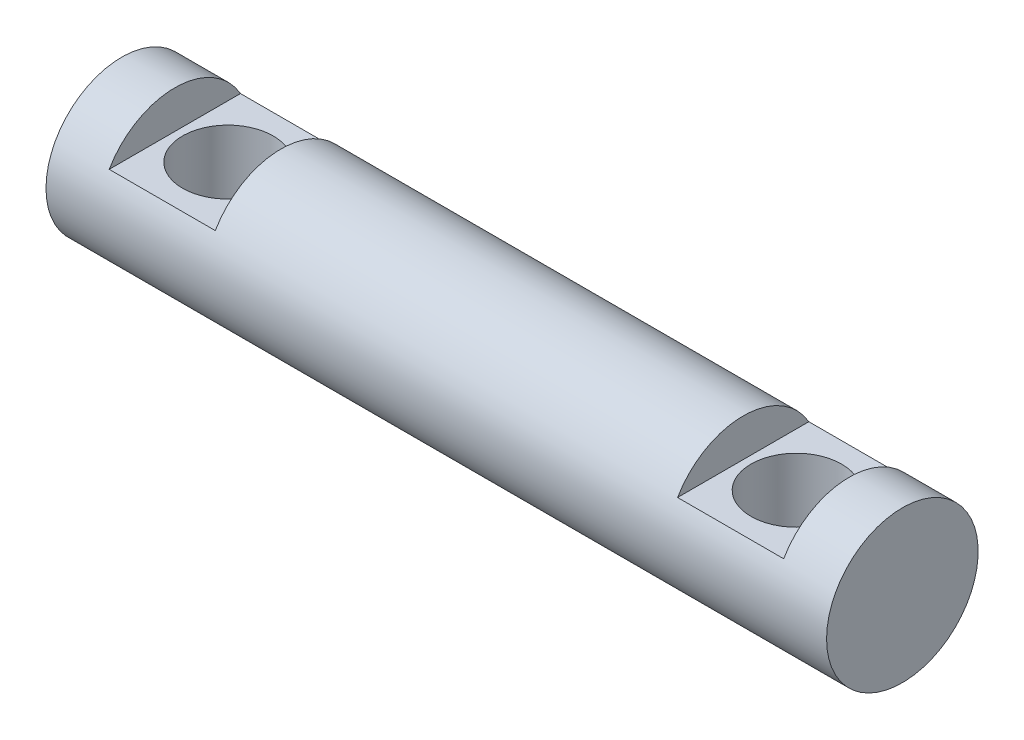
ISO-10303-21;
HEADER;
FILE_DESCRIPTION(('STEP AP214'),'2;1');
FILE_NAME('part.step','',(''),(''),'','','');
FILE_SCHEMA(('AUTOMOTIVE_DESIGN { 1 0 10303 214 1 1 1 1 }'));
ENDSEC;
DATA;
#1=APPLICATION_CONTEXT('core data for automotive mechanical design processes');
#2=APPLICATION_PROTOCOL_DEFINITION('international standard','automotive_design',2000,#1);
#3=PRODUCT_CONTEXT('',#1,'mechanical');
#4=PRODUCT('Part','Part','',(#3));
#5=PRODUCT_RELATED_PRODUCT_CATEGORY('part','',(#4));
#6=PRODUCT_DEFINITION_FORMATION('','',#4);
#7=PRODUCT_DEFINITION_CONTEXT('part definition',#1,'design');
#8=PRODUCT_DEFINITION('design','',#6,#7);
#9=PRODUCT_DEFINITION_SHAPE('','',#8);
#10=(LENGTH_UNIT() NAMED_UNIT(*) SI_UNIT(.MILLI.,.METRE.));
#11=(NAMED_UNIT(*) PLANE_ANGLE_UNIT() SI_UNIT($,.RADIAN.));
#12=(NAMED_UNIT(*) SI_UNIT($,.STERADIAN.) SOLID_ANGLE_UNIT());
#13=UNCERTAINTY_MEASURE_WITH_UNIT(LENGTH_MEASURE(1.E-05),#10,'distance_accuracy_value','');
#14=(GEOMETRIC_REPRESENTATION_CONTEXT(3) GLOBAL_UNCERTAINTY_ASSIGNED_CONTEXT((#13)) GLOBAL_UNIT_ASSIGNED_CONTEXT((#10,
#11,#12)) REPRESENTATION_CONTEXT('',''));
#15=CARTESIAN_POINT('',(0.,0.,0.));
#16=DIRECTION('',(0.,0.,1.));
#17=DIRECTION('',(1.,0.,0.));
#18=AXIS2_PLACEMENT_3D('',#15,#16,#17);
#19=CARTESIAN_POINT('',(0.,0.,0.));
#20=DIRECTION('',(-1.,0.,0.));
#21=DIRECTION('',(0.,0.,1.));
#22=AXIS2_PLACEMENT_3D('',#19,#20,#21);
#23=CYLINDRICAL_SURFACE('',#22,10.);
#24=CARTESIAN_POINT('',(103.,0.,0.));
#25=DIRECTION('',(-1.,0.,0.));
#26=DIRECTION('',(0.,0.,1.));
#27=AXIS2_PLACEMENT_3D('',#24,#25,#26);
#28=CIRCLE('',#27,10.);
#29=CARTESIAN_POINT('',(103.,0.,10.));
#30=VERTEX_POINT('',#29);
#31=EDGE_CURVE('E120',#30,#30,#28,.T.);
#32=ORIENTED_EDGE('',*,*,#31,.T.);
#33=EDGE_LOOP('',(#32));
#34=FACE_BOUND('',#33,.T.);
#35=CARTESIAN_POINT('',(0.,0.,0.));
#36=DIRECTION('',(-1.,0.,0.));
#37=DIRECTION('',(0.,0.,1.));
#38=AXIS2_PLACEMENT_3D('',#35,#36,#37);
#39=CIRCLE('',#38,10.);
#40=CARTESIAN_POINT('',(0.,0.,10.));
#41=VERTEX_POINT('',#40);
#42=EDGE_CURVE('E116',#41,#41,#39,.T.);
#43=ORIENTED_EDGE('',*,*,#42,.F.);
#44=EDGE_LOOP('',(#43));
#45=FACE_BOUND('',#44,.T.);
#46=CARTESIAN_POINT('',(96.,0.,0.));
#47=DIRECTION('',(1.,0.,0.));
#48=DIRECTION('',(0.,0.,-1.));
#49=AXIS2_PLACEMENT_3D('',#46,#47,#48);
#50=CIRCLE('',#49,10.);
#51=CARTESIAN_POINT('',(96.,5.,-8.66025403784439));
#52=VERTEX_POINT('',#51);
#53=CARTESIAN_POINT('',(96.,5.,8.66025403784439));
#54=VERTEX_POINT('',#53);
#55=EDGE_CURVE('E182',#52,#54,#50,.T.);
#56=ORIENTED_EDGE('',*,*,#55,.T.);
#57=DIRECTION('',(-1.,0.,0.));
#58=VECTOR('',#57,1.);
#59=CARTESIAN_POINT('',(0.,5.,8.66025403784439));
#60=LINE('',#59,#58);
#61=CARTESIAN_POINT('',(82.,5.,8.66025403784439));
#62=VERTEX_POINT('',#61);
#63=EDGE_CURVE('E112',#54,#62,#60,.T.);
#64=ORIENTED_EDGE('',*,*,#63,.T.);
#65=CARTESIAN_POINT('',(82.,0.,0.));
#66=DIRECTION('',(1.,0.,0.));
#67=DIRECTION('',(0.,0.,-1.));
#68=AXIS2_PLACEMENT_3D('',#65,#66,#67);
#69=CIRCLE('',#68,10.);
#70=CARTESIAN_POINT('',(82.,5.,-8.66025403784439));
#71=VERTEX_POINT('',#70);
#72=EDGE_CURVE('E188',#71,#62,#69,.T.);
#73=ORIENTED_EDGE('',*,*,#72,.F.);
#74=DIRECTION('',(-1.,0.,0.));
#75=VECTOR('',#74,1.);
#76=CARTESIAN_POINT('',(0.,5.,-8.66025403784439));
#77=LINE('',#76,#75);
#78=EDGE_CURVE('E108',#71,#52,#77,.F.);
#79=ORIENTED_EDGE('',*,*,#78,.T.);
#80=EDGE_LOOP('',(#56,#64,#73,#79));
#81=FACE_BOUND('',#80,.T.);
#82=CARTESIAN_POINT('',(83.017,-10.,0.));
#83=CARTESIAN_POINT('',(83.0170012592624,-9.99999883002161,0.153172315355917));
#84=CARTESIAN_POINT('',(83.0228913696915,-9.996471741835,0.306385435995094));
#85=CARTESIAN_POINT('',(83.0463771135823,-9.98244711097892,0.611656772831272));
#86=CARTESIAN_POINT('',(83.063979714023,-9.97194541959012,0.763714247129809));
#87=CARTESIAN_POINT('',(83.1106961817195,-9.94420717609116,1.06572990920689));
#88=CARTESIAN_POINT('',(83.1398321964793,-9.92695766696624,1.21568347982575));
#89=CARTESIAN_POINT('',(83.2092455908321,-9.88613982957446,1.5121668832874));
#90=CARTESIAN_POINT('',(83.2495277309124,-9.86256880153235,1.6586952241575));
#91=CARTESIAN_POINT('',(83.340500888076,-9.809804997573,1.94653844643532));
#92=CARTESIAN_POINT('',(83.3911341499098,-9.78064346838609,2.08787733235822));
#93=CARTESIAN_POINT('',(83.5024080646036,-9.71726022787209,2.36540813806157));
#94=CARTESIAN_POINT('',(83.5630525832958,-9.68303656234141,2.50159804450516));
#95=CARTESIAN_POINT('',(83.7590853513287,-9.57387303871737,2.90120248947348));
#96=CARTESIAN_POINT('',(83.9086902313427,-9.49237068470068,3.15601827219648));
#97=CARTESIAN_POINT('',(84.2539720526065,-9.31156338389999,3.65665167787378));
#98=CARTESIAN_POINT('',(84.4522917269169,-9.21137495306655,3.90030260097493));
#99=CARTESIAN_POINT('',(84.8836353237701,-9.00622653496039,4.35312068301917));
#100=CARTESIAN_POINT('',(85.1167035751344,-8.90126057357486,4.56224306502644));
#101=CARTESIAN_POINT('',(85.5045251713547,-8.74105166750114,4.85888645828946));
#102=CARTESIAN_POINT('',(85.6487870779499,-8.68419419318971,4.95951050214589));
#103=CARTESIAN_POINT('',(85.9465688262679,-8.57368255902221,5.14819398507323));
#104=CARTESIAN_POINT('',(86.100090177839,-8.52002892443928,5.23625136709718));
#105=CARTESIAN_POINT('',(86.4154889327902,-8.41790827118968,5.39889242806681));
#106=CARTESIAN_POINT('',(86.5773550956577,-8.36943453248746,5.47349365275356));
#107=CARTESIAN_POINT('',(86.908787480234,-8.27958203968969,5.60848483378958));
#108=CARTESIAN_POINT('',(87.0783508216371,-8.23820065884931,5.66888005461255));
#109=CARTESIAN_POINT('',(87.382471757487,-8.17334957955253,5.76183556406732));
#110=CARTESIAN_POINT('',(87.5156502136676,-8.14796522287945,5.79759712653813));
#111=CARTESIAN_POINT('',(87.7851117046681,-8.10321104912285,5.85998709074792));
#112=CARTESIAN_POINT('',(87.9213940488584,-8.08383990783669,5.88661750344198));
#113=CARTESIAN_POINT('',(88.196116110255,-8.05179184223029,5.93037822393736));
#114=CARTESIAN_POINT('',(88.3345534812252,-8.03910809923203,5.94751820937034));
#115=CARTESIAN_POINT('',(88.6127632931179,-8.02087278433981,5.97208807718028));
#116=CARTESIAN_POINT('',(88.7525357572452,-8.01532133663807,5.97951779047561));
#117=CARTESIAN_POINT('',(89.0326278609301,-8.01156228449002,5.98455348136233));
#118=CARTESIAN_POINT('',(89.1729480358812,-8.01336885898131,5.98214049201364));
#119=CARTESIAN_POINT('',(89.4527832834944,-8.02428632158673,5.96748779994581));
#120=CARTESIAN_POINT('',(89.592298352275,-8.03339724488638,5.95524804989051));
#121=CARTESIAN_POINT('',(89.869568985983,-8.05858523443595,5.92111923494675));
#122=CARTESIAN_POINT('',(90.0073237350139,-8.07466541835132,5.89922585147521));
#123=CARTESIAN_POINT('',(90.2801314138693,-8.11320952046305,5.84610109018177));
#124=CARTESIAN_POINT('',(90.4151832161893,-8.13567604559684,5.81486589871361));
#125=CARTESIAN_POINT('',(90.8116755487973,-8.21092585612069,5.70860911718773));
#126=CARTESIAN_POINT('',(91.0681975812124,-8.27193397576603,5.62055926785735));
#127=CARTESIAN_POINT('',(91.5633450539645,-8.40937385549081,5.41275251930397));
#128=CARTESIAN_POINT('',(91.8019638747095,-8.4858112822785,5.29298396572308));
#129=CARTESIAN_POINT('',(92.2989348710774,-8.66162077688792,5.00100868771718));
#130=CARTESIAN_POINT('',(92.5534973011397,-8.76266931489177,4.82330401688185));
#131=CARTESIAN_POINT('',(92.9119701405439,-8.9160286634058,4.52953873119934));
#132=CARTESIAN_POINT('',(93.0276461169262,-8.96748657579318,4.4269926546011));
#133=CARTESIAN_POINT('',(93.2508770688062,-9.06994090530952,4.21310050797644));
#134=CARTESIAN_POINT('',(93.3584305989163,-9.12093723888623,4.10175287889709));
#135=CARTESIAN_POINT('',(93.5791685280839,-9.22832339834368,3.85468712358809));
#136=CARTESIAN_POINT('',(93.6910776788136,-9.28448488673865,3.71772744877681));
#137=CARTESIAN_POINT('',(93.9028790060527,-9.39327860004791,3.43357670768696));
#138=CARTESIAN_POINT('',(94.0027758611835,-9.44591219546892,3.28638966030188));
#139=CARTESIAN_POINT('',(94.1896995645671,-9.54622826640803,2.982469941009));
#140=CARTESIAN_POINT('',(94.2767280303908,-9.59391136398438,2.82573847234837));
#141=CARTESIAN_POINT('',(94.4369491306938,-9.68295877388444,2.50364026169976));
#142=CARTESIAN_POINT('',(94.5101434847276,-9.72432387140107,2.33827459619187));
#143=CARTESIAN_POINT('',(94.6375347416206,-9.7970890347004,2.01081250933036));
#144=CARTESIAN_POINT('',(94.6926423028953,-9.82895482244039,1.84917429734663));
#145=CARTESIAN_POINT('',(94.7890882047237,-9.88512591823179,1.52054684110473));
#146=CARTESIAN_POINT('',(94.830426948233,-9.90943144753897,1.35355775360112));
#147=CARTESIAN_POINT('',(94.8986459447275,-9.94972248531495,1.01583142959597));
#148=CARTESIAN_POINT('',(94.9255404451754,-9.96571619186502,0.845098060072857));
#149=CARTESIAN_POINT('',(94.9644639917568,-9.98890857311546,0.501360440212551));
#150=CARTESIAN_POINT('',(94.9764951008285,-9.99610846833577,0.328356508383348));
#151=CARTESIAN_POINT('',(94.9848761705646,-10.0011224526439,0.0052566039545165));
#152=CARTESIAN_POINT('',(94.9831250580297,-10.0000731489314,-0.144776572930952));
#153=CARTESIAN_POINT('',(94.9683765877093,-9.99125586112222,-0.444090485248554));
#154=CARTESIAN_POINT('',(94.9553795883322,-9.98348809114424,-0.593371244507874));
#155=CARTESIAN_POINT('',(94.9183151409281,-9.96142280177973,-0.890046929233488));
#156=CARTESIAN_POINT('',(94.894248431355,-9.9471257179604,-1.03744197982029));
#157=CARTESIAN_POINT('',(94.8353551695999,-9.91234166250132,-1.32931854136868));
#158=CARTESIAN_POINT('',(94.8005283459908,-9.89185453471609,-1.47379997873554));
#159=CARTESIAN_POINT('',(94.7214743456918,-9.84570837152581,-1.75553779464457));
#160=CARTESIAN_POINT('',(94.6774894223345,-9.82018336387464,-1.89288424998818));
#161=CARTESIAN_POINT('',(94.580107934674,-9.76420690639513,-2.16318006944146));
#162=CARTESIAN_POINT('',(94.5267083355944,-9.73375386830011,-2.29612799924572));
#163=CARTESIAN_POINT('',(94.3531213182043,-9.63589220144152,-2.68731215269446));
#164=CARTESIAN_POINT('',(94.2194871370775,-9.56194597369331,-2.93809458797153));
#165=CARTESIAN_POINT('',(93.9048840883312,-9.39372758192034,-3.44024019753097));
#166=CARTESIAN_POINT('',(93.7204405359047,-9.2981420159876,-3.68895851514596));
#167=CARTESIAN_POINT('',(93.31694147834,-9.09993173212827,-4.15392885866978));
#168=CARTESIAN_POINT('',(93.0978456540131,-8.99729889414904,-4.37014248536271));
#169=CARTESIAN_POINT('',(92.7310297026277,-8.83799260263722,-4.68036396147757));
#170=CARTESIAN_POINT('',(92.5937141460248,-8.78074555019263,-4.78662128951673));
#171=CARTESIAN_POINT('',(92.3097015182145,-8.66838026838182,-4.98722177040132));
#172=CARTESIAN_POINT('',(92.163002042249,-8.61326259054827,-5.08156185071396));
#173=CARTESIAN_POINT('',(91.8609566324189,-8.50698630078418,-5.25754245720965));
#174=CARTESIAN_POINT('',(91.7056167359838,-8.45582498266831,-5.339191703343));
#175=CARTESIAN_POINT('',(91.386950890526,-8.35931964920909,-5.48905427695116));
#176=CARTESIAN_POINT('',(91.2236307095883,-8.31397151559545,-5.55727713471053));
#177=CARTESIAN_POINT('',(90.9258788049113,-8.23994219229898,-5.66627818139737));
#178=CARTESIAN_POINT('',(90.7928163520711,-8.20977595751957,-5.70980192931593));
#179=CARTESIAN_POINT('',(90.5229426163069,-8.1550980574045,-5.78762815207841));
#180=CARTESIAN_POINT('',(90.3861333453214,-8.13058342142881,-5.82193547291148));
#181=CARTESIAN_POINT('',(90.1095934719025,-8.08803231226544,-5.88090621944673));
#182=CARTESIAN_POINT('',(89.9698658543055,-8.06998953309646,-5.9055790348091));
#183=CARTESIAN_POINT('',(89.6882750777622,-8.04100905035859,-5.94497895413852));
#184=CARTESIAN_POINT('',(89.5464119050468,-8.03007139262022,-5.95970599395185));
#185=CARTESIAN_POINT('',(89.2610849047674,-8.0157035918048,-5.97901693471193));
#186=CARTESIAN_POINT('',(89.1176171010661,-8.01230131881731,-5.98356318204921));
#187=CARTESIAN_POINT('',(88.830751207027,-8.01322550062598,-5.98232542550485));
#188=CARTESIAN_POINT('',(88.6873531168293,-8.01755197087184,-5.97654140097309));
#189=CARTESIAN_POINT('',(88.4017047133432,-8.03376135945657,-5.9547343216604));
#190=CARTESIAN_POINT('',(88.2594549875406,-8.04564792453207,-5.93870632551231));
#191=CARTESIAN_POINT('',(87.9772311007686,-8.0765144600898,-5.89665932363137));
#192=CARTESIAN_POINT('',(87.8372569514212,-8.09549446678787,-5.87064026688877));
#193=CARTESIAN_POINT('',(87.5669328465095,-8.13882211096764,-5.81041143517603));
#194=CARTESIAN_POINT('',(87.4364381144233,-8.16287892640696,-5.77663906751142));
#195=CARTESIAN_POINT('',(87.1789555716813,-8.2160833084233,-5.70071237397476));
#196=CARTESIAN_POINT('',(87.0519689613177,-8.24523259298875,-5.65855521875555));
#197=CARTESIAN_POINT('',(86.6771072733356,-8.33913001292367,-5.52008654559968));
#198=CARTESIAN_POINT('',(86.4351929416012,-8.41035114181176,-5.41174669720418));
#199=CARTESIAN_POINT('',(85.9347231668624,-8.57527488456323,-5.14708800650581));
#200=CARTESIAN_POINT('',(85.6793323816594,-8.67075047184362,-4.98595227911821));
#201=CARTESIAN_POINT('',(85.1965524240974,-8.86686228828841,-4.62821116051232));
#202=CARTESIAN_POINT('',(84.969186506551,-8.96750270641831,-4.43157664169138));
#203=CARTESIAN_POINT('',(84.634626353423,-9.12405852027906,-4.09514548082497));
#204=CARTESIAN_POINT('',(84.5169928085287,-9.1810473987885,-3.96604904187601));
#205=CARTESIAN_POINT('',(84.2929918073866,-9.29248033049576,-3.69742101111251));
#206=CARTESIAN_POINT('',(84.1866208742573,-9.34692516614842,-3.55789266256071));
#207=CARTESIAN_POINT('',(83.985867135699,-9.45187362299318,-3.2689048373109));
#208=CARTESIAN_POINT('',(83.8914927444167,-9.50237446847622,-3.11943850098898));
#209=CARTESIAN_POINT('',(83.7157237853159,-9.5980127595356,-2.81143055363125));
#210=CARTESIAN_POINT('',(83.6343275580756,-9.64315089061415,-2.65289010636336));
#211=CARTESIAN_POINT('',(83.4878669909402,-9.72541878920302,-2.33294361208624));
#212=CARTESIAN_POINT('',(83.4223608141871,-9.76275978367246,-2.17179462542482));
#213=CARTESIAN_POINT('',(83.3052744125212,-9.83012289305426,-1.84304639548215));
#214=CARTESIAN_POINT('',(83.2536915228451,-9.86014640834445,-1.67544839349678));
#215=CARTESIAN_POINT('',(83.1653711683078,-9.91187809447216,-1.33570542658517));
#216=CARTESIAN_POINT('',(83.1285873707444,-9.93361220631621,-1.16357647901555));
#217=CARTESIAN_POINT('',(83.0702877335898,-9.96818150210495,-0.815970757029861));
#218=CARTESIAN_POINT('',(83.048759082264,-9.98102415315966,-0.640496919257409));
#219=CARTESIAN_POINT('',(83.0290326475495,-9.99280469010069,-0.387094819496975));
#220=CARTESIAN_POINT('',(83.0245226744407,-9.99550074138585,-0.309775498446496));
#221=CARTESIAN_POINT('',(83.0185059844155,-9.9990987207925,-0.154974269709491));
#222=CARTESIAN_POINT('',(83.0169993629187,-10.000000591911,-0.0774923569355452));
#223=CARTESIAN_POINT('',(83.017,-10.,0.));
#224=B_SPLINE_CURVE_WITH_KNOTS('',3,(#82,#83,#84,#85,#86,#87,#88,#89,#90,#91,#92,#93,#94,#95,
#96,#97,#98,#99,#100,#101,#102,#103,#104,#105,#106,#107,#108,#109,#110,#111,#112,#113,#114,#115,
#116,#117,#118,#119,#120,#121,#122,#123,#124,#125,#126,#127,#128,#129,#130,#131,#132,#133,#134,
#135,#136,#137,#138,#139,#140,#141,#142,#143,#144,#145,#146,#147,#148,#149,#150,#151,#152,#153,
#154,#155,#156,#157,#158,#159,#160,#161,#162,#163,#164,#165,#166,#167,#168,#169,#170,#171,#172,
#173,#174,#175,#176,#177,#178,#179,#180,#181,#182,#183,#184,#185,#186,#187,#188,#189,#190,#191,
#192,#193,#194,#195,#196,#197,#198,#199,#200,#201,#202,#203,#204,#205,#206,#207,#208,#209,#210,
#211,#212,#213,#214,#215,#216,#217,#218,#219,#220,#221,#222,#223),.UNSPECIFIED.,.T.,.F.,(4,2,2,
2,2,2,2,2,2,2,2,2,2,2,2,2,2,2,2,2,2,2,2,2,2,2,2,2,2,2,2,2,2,2,2,2,2,2,2,2,2,2,2,2,2,2,2,2,2,2,2,
2,2,2,2,2,2,2,2,2,2,2,2,2,2,2,2,2,2,2,4),(0.,0.459435064633209,0.919143661146399,
1.3797393476969,1.84053205818026,2.29882065341547,2.75728663186308,3.67305820113111,
4.65863965596632,5.6454893507773,6.19946744887904,6.75353612434252,7.30687703244523,
7.86001255876887,8.28023273076989,8.70036029806117,9.12005865779168,9.53976432548835,
9.96027914992988,10.3807960000311,10.8015011608186,11.2223783028478,12.0528838625302,
12.8836949980642,13.8590531739774,14.347486153104,14.8360058449644,15.3920236241842,
15.9478241359342,16.5035547234402,17.0592161891692,17.5796241699505,18.1000169192274,
18.6198954181514,19.1397017533481,19.5892824377438,20.0388487944476,20.4883851651886,
20.9379328765486,21.3768302496084,21.8158693587072,22.6933039373328,23.6618689951238,
24.6315694188446,25.1794941472823,25.7275598558794,26.2752473043767,26.822544581396,
27.2517661883752,27.6807616673257,28.1093380032706,28.5379171036558,28.9680787019582,
29.3982411601502,29.8286112718402,30.2589835808312,30.6693322534469,31.0798196289987,
31.9003701730181,32.8471457132854,33.7947016657241,34.3452850459914,34.8956979569913,
35.4464948117184,35.9972211835526,36.5301970321356,37.0630708025804,37.5942630316984,
38.1250086190317,38.3574368803257,38.5898725259875),.UNSPECIFIED.);
#225=CARTESIAN_POINT('',(83.017,-10.,0.));
#226=VERTEX_POINT('',#225);
#227=EDGE_CURVE('E124',#226,#226,#224,.T.);
#228=ORIENTED_EDGE('',*,*,#227,.T.);
#229=EDGE_LOOP('',(#228));
#230=FACE_BOUND('',#229,.T.);
#231=CARTESIAN_POINT('',(8.017,-10.,0.));
#232=CARTESIAN_POINT('',(8.0170012592624,-9.99999883002161,0.153172315355917));
#233=CARTESIAN_POINT('',(8.02289136969155,-9.996471741835,0.306385435995093));
#234=CARTESIAN_POINT('',(8.04637711358228,-9.98244711097892,0.611656772831272));
#235=CARTESIAN_POINT('',(8.063979714023,-9.97194541959012,0.763714247129809));
#236=CARTESIAN_POINT('',(8.11069618171953,-9.94420717609116,1.06572990920689));
#237=CARTESIAN_POINT('',(8.13983219647936,-9.92695766696625,1.21568347982575));
#238=CARTESIAN_POINT('',(8.2092455908321,-9.88613982957446,1.5121668832874));
#239=CARTESIAN_POINT('',(8.2495277309124,-9.86256880153235,1.65869522415749));
#240=CARTESIAN_POINT('',(8.34050088807605,-9.809804997573,1.94653844643532));
#241=CARTESIAN_POINT('',(8.39113414990983,-9.78064346838609,2.08787733235822));
#242=CARTESIAN_POINT('',(8.5024080646036,-9.71726022787209,2.36540813806157));
#243=CARTESIAN_POINT('',(8.56305258329584,-9.68303656234141,2.50159804450517));
#244=CARTESIAN_POINT('',(8.7590853513287,-9.57387303871737,2.90120248947348));
#245=CARTESIAN_POINT('',(8.90869023134271,-9.49237068470068,3.15601827219648));
#246=CARTESIAN_POINT('',(9.25397205260648,-9.31156338389999,3.65665167787379));
#247=CARTESIAN_POINT('',(9.45229172691691,-9.21137495306655,3.90030260097494));
#248=CARTESIAN_POINT('',(9.88363532377008,-9.00622653496039,4.35312068301918));
#249=CARTESIAN_POINT('',(10.1167035751345,-8.90126057357486,4.56224306502644));
#250=CARTESIAN_POINT('',(10.5045251713547,-8.74105166750115,4.85888645828946));
#251=CARTESIAN_POINT('',(10.6487870779499,-8.68419419318971,4.95951050214589));
#252=CARTESIAN_POINT('',(10.946568826268,-8.57368255902221,5.14819398507323));
#253=CARTESIAN_POINT('',(11.1000901778391,-8.52002892443928,5.23625136709718));
#254=CARTESIAN_POINT('',(11.4154889327902,-8.41790827118968,5.39889242806681));
#255=CARTESIAN_POINT('',(11.5773550956577,-8.36943453248746,5.47349365275355));
#256=CARTESIAN_POINT('',(11.908787480234,-8.27958203968969,5.60848483378958));
#257=CARTESIAN_POINT('',(12.0783508216371,-8.23820065884931,5.66888005461254));
#258=CARTESIAN_POINT('',(12.382471757487,-8.17334957955254,5.76183556406731));
#259=CARTESIAN_POINT('',(12.5156502136676,-8.14796522287945,5.79759712653813));
#260=CARTESIAN_POINT('',(12.7851117046681,-8.10321104912286,5.85998709074791));
#261=CARTESIAN_POINT('',(12.9213940488584,-8.0838399078367,5.88661750344197));
#262=CARTESIAN_POINT('',(13.196116110255,-8.05179184223029,5.93037822393736));
#263=CARTESIAN_POINT('',(13.3345534812252,-8.03910809923204,5.94751820937033));
#264=CARTESIAN_POINT('',(13.6127632931179,-8.02087278433981,5.97208807718027));
#265=CARTESIAN_POINT('',(13.7525357572452,-8.01532133663808,5.9795177904756));
#266=CARTESIAN_POINT('',(14.0326278609301,-8.01156228449002,5.98455348136232));
#267=CARTESIAN_POINT('',(14.1729480358812,-8.01336885898131,5.98214049201364));
#268=CARTESIAN_POINT('',(14.4527832834944,-8.02428632158673,5.9674877999458));
#269=CARTESIAN_POINT('',(14.592298352275,-8.03339724488639,5.9552480498905));
#270=CARTESIAN_POINT('',(14.869568985983,-8.05858523443595,5.92111923494675));
#271=CARTESIAN_POINT('',(15.0073237350139,-8.07466541835132,5.89922585147521));
#272=CARTESIAN_POINT('',(15.2801314138694,-8.11320952046305,5.84610109018176));
#273=CARTESIAN_POINT('',(15.4151832161893,-8.13567604559685,5.81486589871361));
#274=CARTESIAN_POINT('',(15.8116755487973,-8.21092585612069,5.70860911718773));
#275=CARTESIAN_POINT('',(16.0681975812124,-8.27193397576603,5.62055926785735));
#276=CARTESIAN_POINT('',(16.5633450539645,-8.40937385549081,5.41275251930397));
#277=CARTESIAN_POINT('',(16.8019638747095,-8.4858112822785,5.29298396572308));
#278=CARTESIAN_POINT('',(17.2989348710774,-8.66162077688792,5.00100868771717));
#279=CARTESIAN_POINT('',(17.5534973011397,-8.76266931489177,4.82330401688184));
#280=CARTESIAN_POINT('',(17.9119701405439,-8.9160286634058,4.52953873119933));
#281=CARTESIAN_POINT('',(18.0276461169263,-8.96748657579318,4.42699265460109));
#282=CARTESIAN_POINT('',(18.2508770688062,-9.06994090530953,4.21310050797643));
#283=CARTESIAN_POINT('',(18.3584305989163,-9.12093723888624,4.10175287889708));
#284=CARTESIAN_POINT('',(18.5791685280839,-9.22832339834368,3.85468712358808));
#285=CARTESIAN_POINT('',(18.6910776788136,-9.28448488673865,3.7177274487768));
#286=CARTESIAN_POINT('',(18.9028790060527,-9.39327860004791,3.43357670768696));
#287=CARTESIAN_POINT('',(19.0027758611835,-9.44591219546892,3.28638966030188));
#288=CARTESIAN_POINT('',(19.1896995645671,-9.54622826640803,2.982469941009));
#289=CARTESIAN_POINT('',(19.2767280303908,-9.59391136398438,2.82573847234837));
#290=CARTESIAN_POINT('',(19.4369491306938,-9.68295877388444,2.50364026169976));
#291=CARTESIAN_POINT('',(19.5101434847276,-9.72432387140106,2.33827459619187));
#292=CARTESIAN_POINT('',(19.6375347416206,-9.7970890347004,2.01081250933037));
#293=CARTESIAN_POINT('',(19.6926423028953,-9.82895482244039,1.84917429734664));
#294=CARTESIAN_POINT('',(19.7890882047237,-9.88512591823179,1.52054684110473));
#295=CARTESIAN_POINT('',(19.830426948233,-9.90943144753897,1.35355775360112));
#296=CARTESIAN_POINT('',(19.8986459447275,-9.94972248531495,1.01583142959597));
#297=CARTESIAN_POINT('',(19.9255404451754,-9.96571619186502,0.845098060072854));
#298=CARTESIAN_POINT('',(19.9644639917568,-9.98890857311546,0.501360440212547));
#299=CARTESIAN_POINT('',(19.9764951008285,-9.99610846833577,0.328356508383345));
#300=CARTESIAN_POINT('',(19.9848761705646,-10.0011224526439,0.00525660395451485));
#301=CARTESIAN_POINT('',(19.9831250580297,-10.0000731489314,-0.144776572930953));
#302=CARTESIAN_POINT('',(19.9683765877093,-9.99125586112222,-0.444090485248555));
#303=CARTESIAN_POINT('',(19.9553795883322,-9.98348809114424,-0.593371244507874));
#304=CARTESIAN_POINT('',(19.9183151409281,-9.96142280177973,-0.890046929233487));
#305=CARTESIAN_POINT('',(19.894248431355,-9.9471257179604,-1.03744197982029));
#306=CARTESIAN_POINT('',(19.8353551696,-9.91234166250132,-1.32931854136868));
#307=CARTESIAN_POINT('',(19.8005283459908,-9.89185453471609,-1.47379997873553));
#308=CARTESIAN_POINT('',(19.7214743456918,-9.84570837152581,-1.75553779464457));
#309=CARTESIAN_POINT('',(19.6774894223345,-9.82018336387465,-1.89288424998817));
#310=CARTESIAN_POINT('',(19.580107934674,-9.76420690639514,-2.16318006944145));
#311=CARTESIAN_POINT('',(19.5267083355944,-9.73375386830011,-2.29612799924571));
#312=CARTESIAN_POINT('',(19.3531213182043,-9.63589220144153,-2.68731215269446));
#313=CARTESIAN_POINT('',(19.2194871370775,-9.56194597369331,-2.93809458797153));
#314=CARTESIAN_POINT('',(18.9048840883312,-9.39372758192034,-3.44024019753097));
#315=CARTESIAN_POINT('',(18.7204405359047,-9.29814201598761,-3.68895851514596));
#316=CARTESIAN_POINT('',(18.31694147834,-9.09993173212828,-4.15392885866978));
#317=CARTESIAN_POINT('',(18.0978456540132,-8.99729889414904,-4.3701424853627));
#318=CARTESIAN_POINT('',(17.7310297026277,-8.83799260263723,-4.68036396147756));
#319=CARTESIAN_POINT('',(17.5937141460248,-8.78074555019264,-4.78662128951672));
#320=CARTESIAN_POINT('',(17.3097015182145,-8.66838026838182,-4.98722177040131));
#321=CARTESIAN_POINT('',(17.163002042249,-8.61326259054828,-5.08156185071395));
#322=CARTESIAN_POINT('',(16.8609566324189,-8.50698630078418,-5.25754245720965));
#323=CARTESIAN_POINT('',(16.7056167359838,-8.45582498266831,-5.33919170334299));
#324=CARTESIAN_POINT('',(16.386950890526,-8.3593196492091,-5.48905427695115));
#325=CARTESIAN_POINT('',(16.2236307095883,-8.31397151559545,-5.55727713471052));
#326=CARTESIAN_POINT('',(15.9258788049113,-8.23994219229898,-5.66627818139737));
#327=CARTESIAN_POINT('',(15.7928163520711,-8.20977595751957,-5.70980192931593));
#328=CARTESIAN_POINT('',(15.5229426163069,-8.1550980574045,-5.78762815207841));
#329=CARTESIAN_POINT('',(15.3861333453215,-8.13058342142881,-5.82193547291147));
#330=CARTESIAN_POINT('',(15.1095934719025,-8.08803231226544,-5.88090621944673));
#331=CARTESIAN_POINT('',(14.9698658543055,-8.06998953309647,-5.9055790348091));
#332=CARTESIAN_POINT('',(14.6882750777622,-8.0410090503586,-5.94497895413851));
#333=CARTESIAN_POINT('',(14.5464119050468,-8.03007139262022,-5.95970599395184));
#334=CARTESIAN_POINT('',(14.2610849047674,-8.01570359180481,-5.97901693471192));
#335=CARTESIAN_POINT('',(14.1176171010661,-8.01230131881731,-5.98356318204921));
#336=CARTESIAN_POINT('',(13.830751207027,-8.01322550062599,-5.98232542550485));
#337=CARTESIAN_POINT('',(13.6873531168293,-8.01755197087184,-5.97654140097309));
#338=CARTESIAN_POINT('',(13.4017047133432,-8.03376135945657,-5.9547343216604));
#339=CARTESIAN_POINT('',(13.2594549875406,-8.04564792453207,-5.9387063255123));
#340=CARTESIAN_POINT('',(12.9772311007687,-8.0765144600898,-5.89665932363137));
#341=CARTESIAN_POINT('',(12.8372569514212,-8.09549446678787,-5.87064026688877));
#342=CARTESIAN_POINT('',(12.5669328465095,-8.13882211096764,-5.81041143517603));
#343=CARTESIAN_POINT('',(12.4364381144233,-8.16287892640696,-5.77663906751142));
#344=CARTESIAN_POINT('',(12.1789555716813,-8.2160833084233,-5.70071237397476));
#345=CARTESIAN_POINT('',(12.0519689613177,-8.24523259298875,-5.65855521875555));
#346=CARTESIAN_POINT('',(11.6771072733356,-8.33913001292366,-5.52008654559969));
#347=CARTESIAN_POINT('',(11.4351929416013,-8.41035114181175,-5.41174669720419));
#348=CARTESIAN_POINT('',(10.9347231668625,-8.57527488456322,-5.14708800650583));
#349=CARTESIAN_POINT('',(10.6793323816594,-8.67075047184361,-4.98595227911822));
#350=CARTESIAN_POINT('',(10.1965524240975,-8.8668622882884,-4.62821116051234));
#351=CARTESIAN_POINT('',(9.96918650655105,-8.9675027064183,-4.4315766416914));
#352=CARTESIAN_POINT('',(9.63462635342304,-9.12405852027904,-4.09514548082499));
#353=CARTESIAN_POINT('',(9.51699280852876,-9.18104739878849,-3.96604904187604));
#354=CARTESIAN_POINT('',(9.29299180738666,-9.29248033049575,-3.69742101111254));
#355=CARTESIAN_POINT('',(9.18662087425732,-9.34692516614841,-3.55789266256073));
#356=CARTESIAN_POINT('',(8.98586713569904,-9.45187362299317,-3.26890483731093));
#357=CARTESIAN_POINT('',(8.89149274441671,-9.50237446847621,-3.119438500989));
#358=CARTESIAN_POINT('',(8.71572378531589,-9.59801275953559,-2.81143055363128));
#359=CARTESIAN_POINT('',(8.63432755807559,-9.64315089061414,-2.65289010636339));
#360=CARTESIAN_POINT('',(8.48786699094029,-9.72541878920301,-2.33294361208626));
#361=CARTESIAN_POINT('',(8.42236081418708,-9.76275978367246,-2.17179462542485));
#362=CARTESIAN_POINT('',(8.30527441252122,-9.83012289305426,-1.84304639548217));
#363=CARTESIAN_POINT('',(8.25369152284513,-9.86014640834444,-1.67544839349681));
#364=CARTESIAN_POINT('',(8.16537116830782,-9.91187809447216,-1.3357054265852));
#365=CARTESIAN_POINT('',(8.12858737074439,-9.9336122063162,-1.16357647901558));
#366=CARTESIAN_POINT('',(8.0702877335898,-9.96818150210495,-0.815970757029891));
#367=CARTESIAN_POINT('',(8.04875908226402,-9.98102415315966,-0.64049691925744));
#368=CARTESIAN_POINT('',(8.02903264754956,-9.99280469010069,-0.387094819497));
#369=CARTESIAN_POINT('',(8.02452267444071,-9.99550074138585,-0.309775498446515));
#370=CARTESIAN_POINT('',(8.01850598441552,-9.9990987207925,-0.154974269709499));
#371=CARTESIAN_POINT('',(8.01699936291875,-10.000000591911,-0.0774923569355493));
#372=CARTESIAN_POINT('',(8.017,-10.,0.));
#373=B_SPLINE_CURVE_WITH_KNOTS('',3,(#231,#232,#233,#234,#235,#236,#237,#238,#239,#240,#241,
#242,#243,#244,#245,#246,#247,#248,#249,#250,#251,#252,#253,#254,#255,#256,#257,#258,#259,#260,
#261,#262,#263,#264,#265,#266,#267,#268,#269,#270,#271,#272,#273,#274,#275,#276,#277,#278,#279,
#280,#281,#282,#283,#284,#285,#286,#287,#288,#289,#290,#291,#292,#293,#294,#295,#296,#297,#298,
#299,#300,#301,#302,#303,#304,#305,#306,#307,#308,#309,#310,#311,#312,#313,#314,#315,#316,#317,
#318,#319,#320,#321,#322,#323,#324,#325,#326,#327,#328,#329,#330,#331,#332,#333,#334,#335,#336,
#337,#338,#339,#340,#341,#342,#343,#344,#345,#346,#347,#348,#349,#350,#351,#352,#353,#354,#355,
#356,#357,#358,#359,#360,#361,#362,#363,#364,#365,#366,#367,#368,#369,#370,#371,#372),
.UNSPECIFIED.,.T.,.F.,(4,2,2,2,2,2,2,2,2,2,2,2,2,2,2,2,2,2,2,2,2,2,2,2,2,2,2,2,2,2,2,2,2,2,2,2,
2,2,2,2,2,2,2,2,2,2,2,2,2,2,2,2,2,2,2,2,2,2,2,2,2,2,2,2,2,2,2,2,2,2,4),(0.,0.459435064633208,
0.9191436611464,1.3797393476969,1.84053205818026,2.29882065341547,2.75728663186308,
3.67305820113111,4.65863965596632,5.64548935077731,6.19946744887905,6.75353612434253,
7.30687703244523,7.86001255876887,8.28023273076989,8.70036029806116,9.12005865779168,
9.53976432548834,9.96027914992986,10.3807960000311,10.8015011608186,11.2223783028478,
12.0528838625302,12.8836949980642,13.8590531739774,14.347486153104,14.8360058449643,
15.3920236241842,15.9478241359342,16.5035547234402,17.0592161891692,17.5796241699505,
18.1000169192274,18.6198954181514,19.1397017533481,19.5892824377438,20.0388487944476,
20.4883851651886,20.9379328765486,21.3768302496084,21.8158693587072,22.6933039373328,
23.6618689951237,24.6315694188446,25.1794941472823,25.7275598558794,26.2752473043767,
26.822544581396,27.2517661883752,27.6807616673257,28.1093380032706,28.5379171036558,
28.9680787019581,29.3982411601502,29.8286112718402,30.2589835808312,30.6693322534469,
31.0798196289987,31.900370173018,32.8471457132854,33.7947016657241,34.3452850459913,
34.8956979569912,35.4464948117183,35.9972211835525,36.5301970321355,37.0630708025804,
37.5942630316983,38.1250086190316,38.3574368803257,38.5898725259875),.UNSPECIFIED.);
#374=CARTESIAN_POINT('',(8.017,-10.,0.));
#375=VERTEX_POINT('',#374);
#376=EDGE_CURVE('E133',#375,#375,#373,.T.);
#377=ORIENTED_EDGE('',*,*,#376,.T.);
#378=EDGE_LOOP('',(#377));
#379=FACE_BOUND('',#378,.T.);
#380=DIRECTION('',(-1.,0.,0.));
#381=VECTOR('',#380,1.);
#382=CARTESIAN_POINT('',(0.,5.,-8.66025403784439));
#383=LINE('',#382,#381);
#384=CARTESIAN_POINT('',(21.,5.,-8.66025403784439));
#385=VERTEX_POINT('',#384);
#386=CARTESIAN_POINT('',(7.,5.,-8.66025403784439));
#387=VERTEX_POINT('',#386);
#388=EDGE_CURVE('E83',#385,#387,#383,.T.);
#389=ORIENTED_EDGE('',*,*,#388,.F.);
#390=CARTESIAN_POINT('',(21.,0.,0.));
#391=DIRECTION('',(1.,0.,0.));
#392=DIRECTION('',(0.,0.,-1.));
#393=AXIS2_PLACEMENT_3D('',#390,#391,#392);
#394=CIRCLE('',#393,10.);
#395=CARTESIAN_POINT('',(21.,5.,8.66025403784439));
#396=VERTEX_POINT('',#395);
#397=EDGE_CURVE('E48',#385,#396,#394,.T.);
#398=ORIENTED_EDGE('',*,*,#397,.T.);
#399=DIRECTION('',(-1.,0.,0.));
#400=VECTOR('',#399,1.);
#401=CARTESIAN_POINT('',(0.,5.,8.66025403784439));
#402=LINE('',#401,#400);
#403=CARTESIAN_POINT('',(7.,5.,8.66025403784439));
#404=VERTEX_POINT('',#403);
#405=EDGE_CURVE('E84',#404,#396,#402,.F.);
#406=ORIENTED_EDGE('',*,*,#405,.F.);
#407=CARTESIAN_POINT('',(7.,0.,0.));
#408=DIRECTION('',(1.,0.,0.));
#409=DIRECTION('',(0.,0.,-1.));
#410=AXIS2_PLACEMENT_3D('',#407,#408,#409);
#411=CIRCLE('',#410,10.);
#412=EDGE_CURVE('E11',#387,#404,#411,.T.);
#413=ORIENTED_EDGE('',*,*,#412,.F.);
#414=EDGE_LOOP('',(#389,#398,#406,#413));
#415=FACE_BOUND('',#414,.T.);
#416=ADVANCED_FACE('F39',(#34,#45,#81,#230,#379,#415),#23,.T.);
#417=CARTESIAN_POINT('',(14.,-10.,0.));
#418=DIRECTION('',(0.,1.,0.));
#419=DIRECTION('',(0.,0.,1.));
#420=AXIS2_PLACEMENT_3D('',#417,#418,#419);
#421=CYLINDRICAL_SURFACE('',#420,5.983);
#422=ORIENTED_EDGE('',*,*,#376,.F.);
#423=EDGE_LOOP('',(#422));
#424=FACE_BOUND('',#423,.T.);
#425=CARTESIAN_POINT('',(14.,5.,0.));
#426=DIRECTION('',(0.,1.,0.));
#427=DIRECTION('',(0.,0.,1.));
#428=AXIS2_PLACEMENT_3D('',#425,#426,#427);
#429=CIRCLE('',#428,5.983);
#430=CARTESIAN_POINT('',(14.,5.,5.983));
#431=VERTEX_POINT('',#430);
#432=EDGE_CURVE('E98',#431,#431,#429,.F.);
#433=ORIENTED_EDGE('',*,*,#432,.F.);
#434=EDGE_LOOP('',(#433));
#435=FACE_BOUND('',#434,.T.);
#436=ADVANCED_FACE('F145',(#424,#435),#421,.F.);
#437=CARTESIAN_POINT('',(0.,10.,0.));
#438=DIRECTION('',(1.,0.,0.));
#439=DIRECTION('',(0.,0.,-1.));
#440=AXIS2_PLACEMENT_3D('',#437,#438,#439);
#441=PLANE('',#440);
#442=ORIENTED_EDGE('',*,*,#42,.T.);
#443=EDGE_LOOP('',(#442));
#444=FACE_BOUND('',#443,.T.);
#445=ADVANCED_FACE('F41',(#444),#441,.F.);
#446=CARTESIAN_POINT('',(103.,0.,0.));
#447=DIRECTION('',(-1.,0.,0.));
#448=DIRECTION('',(0.,0.,1.));
#449=AXIS2_PLACEMENT_3D('',#446,#447,#448);
#450=PLANE('',#449);
#451=ORIENTED_EDGE('',*,*,#31,.F.);
#452=EDGE_LOOP('',(#451));
#453=FACE_BOUND('',#452,.T.);
#454=ADVANCED_FACE('F143',(#453),#450,.F.);
#455=CARTESIAN_POINT('',(89.,-10.,0.));
#456=DIRECTION('',(0.,1.,0.));
#457=DIRECTION('',(0.,0.,1.));
#458=AXIS2_PLACEMENT_3D('',#455,#456,#457);
#459=CYLINDRICAL_SURFACE('',#458,5.98300000000001);
#460=CARTESIAN_POINT('',(89.,5.,0.));
#461=DIRECTION('',(0.,-1.,0.));
#462=DIRECTION('',(0.,0.,-1.));
#463=AXIS2_PLACEMENT_3D('',#460,#461,#462);
#464=CIRCLE('',#463,5.98300000000001);
#465=CARTESIAN_POINT('',(89.,5.,-5.98300000000001));
#466=VERTEX_POINT('',#465);
#467=EDGE_CURVE('E91',#466,#466,#464,.F.);
#468=ORIENTED_EDGE('',*,*,#467,.T.);
#469=EDGE_LOOP('',(#468));
#470=FACE_BOUND('',#469,.T.);
#471=ORIENTED_EDGE('',*,*,#227,.F.);
#472=EDGE_LOOP('',(#471));
#473=FACE_BOUND('',#472,.T.);
#474=ADVANCED_FACE('F140',(#470,#473),#459,.F.);
#475=CARTESIAN_POINT('',(7.,10.,-10.));
#476=DIRECTION('',(1.,0.,0.));
#477=DIRECTION('',(0.,0.,-1.));
#478=AXIS2_PLACEMENT_3D('',#475,#476,#477);
#479=PLANE('',#478);
#480=DIRECTION('',(0.,0.,1.));
#481=VECTOR('',#480,1.);
#482=CARTESIAN_POINT('',(7.,5.,-10.));
#483=LINE('',#482,#481);
#484=EDGE_CURVE('E55',#387,#404,#483,.T.);
#485=ORIENTED_EDGE('',*,*,#484,.F.);
#486=ORIENTED_EDGE('',*,*,#412,.T.);
#487=EDGE_LOOP('',(#485,#486));
#488=FACE_BOUND('',#487,.T.);
#489=ADVANCED_FACE('F93',(#488),#479,.T.);
#490=CARTESIAN_POINT('',(21.,10.,-10.));
#491=DIRECTION('',(1.,0.,0.));
#492=DIRECTION('',(0.,0.,-1.));
#493=AXIS2_PLACEMENT_3D('',#490,#491,#492);
#494=PLANE('',#493);
#495=DIRECTION('',(0.,0.,1.));
#496=VECTOR('',#495,1.);
#497=CARTESIAN_POINT('',(21.,5.,-10.));
#498=LINE('',#497,#496);
#499=EDGE_CURVE('E89',#385,#396,#498,.T.);
#500=ORIENTED_EDGE('',*,*,#499,.T.);
#501=ORIENTED_EDGE('',*,*,#397,.F.);
#502=EDGE_LOOP('',(#500,#501));
#503=FACE_BOUND('',#502,.T.);
#504=ADVANCED_FACE('F164',(#503),#494,.F.);
#505=CARTESIAN_POINT('',(0.,5.,0.));
#506=DIRECTION('',(0.,1.,0.));
#507=DIRECTION('',(0.,0.,1.));
#508=AXIS2_PLACEMENT_3D('',#505,#506,#507);
#509=PLANE('',#508);
#510=ORIENTED_EDGE('',*,*,#432,.T.);
#511=EDGE_LOOP('',(#510));
#512=FACE_BOUND('',#511,.T.);
#513=ORIENTED_EDGE('',*,*,#388,.T.);
#514=ORIENTED_EDGE('',*,*,#484,.T.);
#515=ORIENTED_EDGE('',*,*,#405,.T.);
#516=ORIENTED_EDGE('',*,*,#499,.F.);
#517=EDGE_LOOP('',(#513,#514,#515,#516));
#518=FACE_BOUND('',#517,.T.);
#519=ADVANCED_FACE('F87',(#512,#518),#509,.T.);
#520=CARTESIAN_POINT('',(96.,10.,-10.));
#521=DIRECTION('',(1.,0.,0.));
#522=DIRECTION('',(0.,0.,-1.));
#523=AXIS2_PLACEMENT_3D('',#520,#521,#522);
#524=PLANE('',#523);
#525=DIRECTION('',(0.,0.,1.));
#526=VECTOR('',#525,1.);
#527=CARTESIAN_POINT('',(96.,5.,-10.));
#528=LINE('',#527,#526);
#529=EDGE_CURVE('E62',#52,#54,#528,.T.);
#530=ORIENTED_EDGE('',*,*,#529,.T.);
#531=ORIENTED_EDGE('',*,*,#55,.F.);
#532=EDGE_LOOP('',(#530,#531));
#533=FACE_BOUND('',#532,.T.);
#534=ADVANCED_FACE('F157',(#533),#524,.F.);
#535=CARTESIAN_POINT('',(82.,10.,-10.));
#536=DIRECTION('',(1.,0.,0.));
#537=DIRECTION('',(0.,0.,-1.));
#538=AXIS2_PLACEMENT_3D('',#535,#536,#537);
#539=PLANE('',#538);
#540=ORIENTED_EDGE('',*,*,#72,.T.);
#541=DIRECTION('',(0.,0.,1.));
#542=VECTOR('',#541,1.);
#543=CARTESIAN_POINT('',(82.,5.,-10.));
#544=LINE('',#543,#542);
#545=EDGE_CURVE('E100',#71,#62,#544,.T.);
#546=ORIENTED_EDGE('',*,*,#545,.F.);
#547=EDGE_LOOP('',(#540,#546));
#548=FACE_BOUND('',#547,.T.);
#549=ADVANCED_FACE('F153',(#548),#539,.T.);
#550=CARTESIAN_POINT('',(0.,5.,0.));
#551=DIRECTION('',(0.,-1.,0.));
#552=DIRECTION('',(0.,0.,-1.));
#553=AXIS2_PLACEMENT_3D('',#550,#551,#552);
#554=PLANE('',#553);
#555=ORIENTED_EDGE('',*,*,#467,.F.);
#556=EDGE_LOOP('',(#555));
#557=FACE_BOUND('',#556,.T.);
#558=ORIENTED_EDGE('',*,*,#529,.F.);
#559=ORIENTED_EDGE('',*,*,#78,.F.);
#560=ORIENTED_EDGE('',*,*,#545,.T.);
#561=ORIENTED_EDGE('',*,*,#63,.F.);
#562=EDGE_LOOP('',(#558,#559,#560,#561));
#563=FACE_BOUND('',#562,.T.);
#564=ADVANCED_FACE('F150',(#557,#563),#554,.F.);
#565=CLOSED_SHELL('',(#416,#436,#445,#454,#474,#489,#504,#519,#534,#549,#564));
#566=MANIFOLD_SOLID_BREP('B2',#565);
#567=ADVANCED_BREP_SHAPE_REPRESENTATION('',(#18,#566),#14);
#568=SHAPE_DEFINITION_REPRESENTATION(#9,#567);
ENDSEC;
END-ISO-10303-21;
